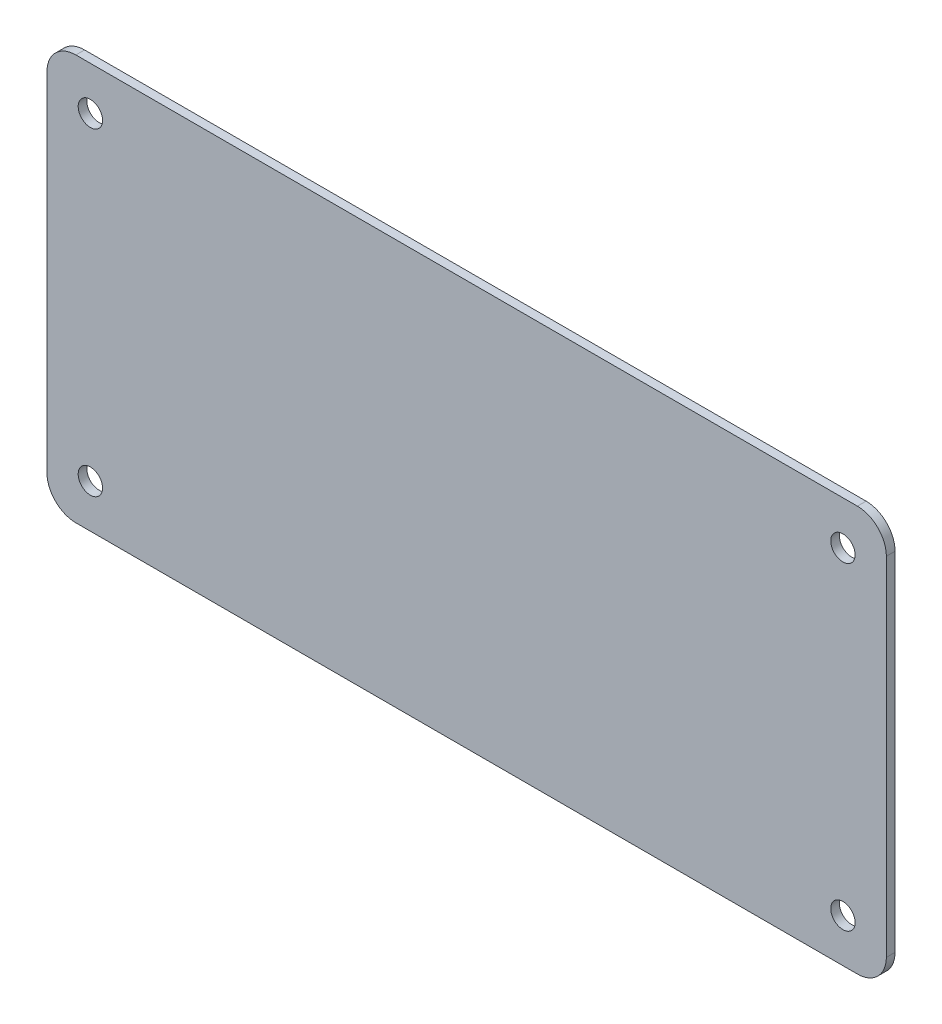
ISO-10303-21;
HEADER;
FILE_DESCRIPTION(('STEP AP214'),'2;1');
FILE_NAME('part.step','',(''),(''),'','','');
FILE_SCHEMA(('AUTOMOTIVE_DESIGN { 1 0 10303 214 1 1 1 1 }'));
ENDSEC;
DATA;
#1=APPLICATION_CONTEXT('core data for automotive mechanical design processes');
#2=APPLICATION_PROTOCOL_DEFINITION('international standard','automotive_design',2000,#1);
#3=PRODUCT_CONTEXT('',#1,'mechanical');
#4=PRODUCT('Part','Part','',(#3));
#5=PRODUCT_RELATED_PRODUCT_CATEGORY('part','',(#4));
#6=PRODUCT_DEFINITION_FORMATION('','',#4);
#7=PRODUCT_DEFINITION_CONTEXT('part definition',#1,'design');
#8=PRODUCT_DEFINITION('design','',#6,#7);
#9=PRODUCT_DEFINITION_SHAPE('','',#8);
#10=(LENGTH_UNIT() NAMED_UNIT(*) SI_UNIT(.MILLI.,.METRE.));
#11=(NAMED_UNIT(*) PLANE_ANGLE_UNIT() SI_UNIT($,.RADIAN.));
#12=(NAMED_UNIT(*) SI_UNIT($,.STERADIAN.) SOLID_ANGLE_UNIT());
#13=UNCERTAINTY_MEASURE_WITH_UNIT(LENGTH_MEASURE(1.E-05),#10,'distance_accuracy_value','');
#14=(GEOMETRIC_REPRESENTATION_CONTEXT(3) GLOBAL_UNCERTAINTY_ASSIGNED_CONTEXT((#13)) GLOBAL_UNIT_ASSIGNED_CONTEXT((#10,
#11,#12)) REPRESENTATION_CONTEXT('',''));
#15=CARTESIAN_POINT('',(0.,0.,0.));
#16=DIRECTION('',(0.,0.,1.));
#17=DIRECTION('',(1.,0.,0.));
#18=AXIS2_PLACEMENT_3D('',#15,#16,#17);
#19=CARTESIAN_POINT('',(145.,70.,3.));
#20=DIRECTION('',(-1.,0.,0.));
#21=DIRECTION('',(0.,-1.,0.));
#22=AXIS2_PLACEMENT_3D('',#19,#20,#21);
#23=PLANE('',#22);
#24=DIRECTION('',(0.,1.,0.));
#25=VECTOR('',#24,1.);
#26=CARTESIAN_POINT('',(145.,70.,3.));
#27=LINE('',#26,#25);
#28=CARTESIAN_POINT('',(145.,-60.,3.));
#29=VERTEX_POINT('',#28);
#30=CARTESIAN_POINT('',(145.,60.,3.));
#31=VERTEX_POINT('',#30);
#32=EDGE_CURVE('E129',#29,#31,#27,.T.);
#33=ORIENTED_EDGE('',*,*,#32,.F.);
#34=DIRECTION('',(0.,0.,-1.));
#35=VECTOR('',#34,1.);
#36=CARTESIAN_POINT('',(145.,-60.,3.));
#37=LINE('',#36,#35);
#38=CARTESIAN_POINT('',(145.,-60.,0.));
#39=VERTEX_POINT('',#38);
#40=EDGE_CURVE('E11',#29,#39,#37,.T.);
#41=ORIENTED_EDGE('',*,*,#40,.T.);
#42=DIRECTION('',(0.,1.,0.));
#43=VECTOR('',#42,1.);
#44=CARTESIAN_POINT('',(145.,70.,0.));
#45=LINE('',#44,#43);
#46=CARTESIAN_POINT('',(145.,60.,0.));
#47=VERTEX_POINT('',#46);
#48=EDGE_CURVE('E131',#39,#47,#45,.T.);
#49=ORIENTED_EDGE('',*,*,#48,.T.);
#50=DIRECTION('',(0.,0.,-1.));
#51=VECTOR('',#50,1.);
#52=CARTESIAN_POINT('',(145.,60.,3.));
#53=LINE('',#52,#51);
#54=EDGE_CURVE('E42',#47,#31,#53,.F.);
#55=ORIENTED_EDGE('',*,*,#54,.T.);
#56=EDGE_LOOP('',(#33,#41,#49,#55));
#57=FACE_BOUND('',#56,.T.);
#58=ADVANCED_FACE('F34',(#57),#23,.F.);
#59=CARTESIAN_POINT('',(-145.,70.,3.));
#60=DIRECTION('',(0.,-1.,0.));
#61=DIRECTION('',(0.,0.,-1.));
#62=AXIS2_PLACEMENT_3D('',#59,#60,#61);
#63=PLANE('',#62);
#64=DIRECTION('',(-1.,0.,0.));
#65=VECTOR('',#64,1.);
#66=CARTESIAN_POINT('',(-145.,70.,0.));
#67=LINE('',#66,#65);
#68=CARTESIAN_POINT('',(135.,70.,0.));
#69=VERTEX_POINT('',#68);
#70=CARTESIAN_POINT('',(-135.,70.,0.));
#71=VERTEX_POINT('',#70);
#72=EDGE_CURVE('E127',#69,#71,#67,.T.);
#73=ORIENTED_EDGE('',*,*,#72,.T.);
#74=DIRECTION('',(0.,0.,-1.));
#75=VECTOR('',#74,1.);
#76=CARTESIAN_POINT('',(-135.,70.,3.));
#77=LINE('',#76,#75);
#78=CARTESIAN_POINT('',(-135.,70.,3.));
#79=VERTEX_POINT('',#78);
#80=EDGE_CURVE('E106',#71,#79,#77,.F.);
#81=ORIENTED_EDGE('',*,*,#80,.T.);
#82=DIRECTION('',(-1.,0.,0.));
#83=VECTOR('',#82,1.);
#84=CARTESIAN_POINT('',(-145.,70.,3.));
#85=LINE('',#84,#83);
#86=CARTESIAN_POINT('',(135.,70.,3.));
#87=VERTEX_POINT('',#86);
#88=EDGE_CURVE('E167',#87,#79,#85,.T.);
#89=ORIENTED_EDGE('',*,*,#88,.F.);
#90=DIRECTION('',(0.,0.,-1.));
#91=VECTOR('',#90,1.);
#92=CARTESIAN_POINT('',(135.,70.,3.));
#93=LINE('',#92,#91);
#94=EDGE_CURVE('E111',#87,#69,#93,.T.);
#95=ORIENTED_EDGE('',*,*,#94,.T.);
#96=EDGE_LOOP('',(#73,#81,#89,#95));
#97=FACE_BOUND('',#96,.T.);
#98=ADVANCED_FACE('F171',(#97),#63,.F.);
#99=CARTESIAN_POINT('',(-145.,70.,3.));
#100=DIRECTION('',(1.,0.,0.));
#101=DIRECTION('',(0.,1.,0.));
#102=AXIS2_PLACEMENT_3D('',#99,#100,#101);
#103=PLANE('',#102);
#104=DIRECTION('',(0.,-1.,0.));
#105=VECTOR('',#104,1.);
#106=CARTESIAN_POINT('',(-145.,70.,3.));
#107=LINE('',#106,#105);
#108=CARTESIAN_POINT('',(-145.,60.,3.));
#109=VERTEX_POINT('',#108);
#110=CARTESIAN_POINT('',(-145.,-60.,3.));
#111=VERTEX_POINT('',#110);
#112=EDGE_CURVE('E120',#109,#111,#107,.T.);
#113=ORIENTED_EDGE('',*,*,#112,.F.);
#114=DIRECTION('',(0.,0.,-1.));
#115=VECTOR('',#114,1.);
#116=CARTESIAN_POINT('',(-145.,60.,3.));
#117=LINE('',#116,#115);
#118=CARTESIAN_POINT('',(-145.,60.,0.));
#119=VERTEX_POINT('',#118);
#120=EDGE_CURVE('E105',#109,#119,#117,.T.);
#121=ORIENTED_EDGE('',*,*,#120,.T.);
#122=DIRECTION('',(0.,-1.,0.));
#123=VECTOR('',#122,1.);
#124=CARTESIAN_POINT('',(-145.,70.,0.));
#125=LINE('',#124,#123);
#126=CARTESIAN_POINT('',(-145.,-60.,0.));
#127=VERTEX_POINT('',#126);
#128=EDGE_CURVE('E118',#119,#127,#125,.T.);
#129=ORIENTED_EDGE('',*,*,#128,.T.);
#130=DIRECTION('',(0.,0.,-1.));
#131=VECTOR('',#130,1.);
#132=CARTESIAN_POINT('',(-145.,-60.,3.));
#133=LINE('',#132,#131);
#134=EDGE_CURVE('E122',#127,#111,#133,.F.);
#135=ORIENTED_EDGE('',*,*,#134,.T.);
#136=EDGE_LOOP('',(#113,#121,#129,#135));
#137=FACE_BOUND('',#136,.T.);
#138=ADVANCED_FACE('F117',(#137),#103,.F.);
#139=CARTESIAN_POINT('',(-145.,-70.,3.));
#140=DIRECTION('',(0.,1.,0.));
#141=DIRECTION('',(0.,0.,1.));
#142=AXIS2_PLACEMENT_3D('',#139,#140,#141);
#143=PLANE('',#142);
#144=DIRECTION('',(1.,0.,0.));
#145=VECTOR('',#144,1.);
#146=CARTESIAN_POINT('',(-145.,-70.,3.));
#147=LINE('',#146,#145);
#148=CARTESIAN_POINT('',(-135.,-70.,3.));
#149=VERTEX_POINT('',#148);
#150=CARTESIAN_POINT('',(135.,-70.,3.));
#151=VERTEX_POINT('',#150);
#152=EDGE_CURVE('E135',#149,#151,#147,.T.);
#153=ORIENTED_EDGE('',*,*,#152,.F.);
#154=DIRECTION('',(0.,0.,-1.));
#155=VECTOR('',#154,1.);
#156=CARTESIAN_POINT('',(-135.,-70.,3.));
#157=LINE('',#156,#155);
#158=CARTESIAN_POINT('',(-135.,-70.,0.));
#159=VERTEX_POINT('',#158);
#160=EDGE_CURVE('E152',#149,#159,#157,.T.);
#161=ORIENTED_EDGE('',*,*,#160,.T.);
#162=DIRECTION('',(1.,0.,0.));
#163=VECTOR('',#162,1.);
#164=CARTESIAN_POINT('',(-145.,-70.,0.));
#165=LINE('',#164,#163);
#166=CARTESIAN_POINT('',(135.,-70.,0.));
#167=VERTEX_POINT('',#166);
#168=EDGE_CURVE('E126',#159,#167,#165,.T.);
#169=ORIENTED_EDGE('',*,*,#168,.T.);
#170=DIRECTION('',(0.,0.,-1.));
#171=VECTOR('',#170,1.);
#172=CARTESIAN_POINT('',(135.,-70.,3.));
#173=LINE('',#172,#171);
#174=EDGE_CURVE('E49',#167,#151,#173,.F.);
#175=ORIENTED_EDGE('',*,*,#174,.T.);
#176=EDGE_LOOP('',(#153,#161,#169,#175));
#177=FACE_BOUND('',#176,.T.);
#178=ADVANCED_FACE('F212',(#177),#143,.F.);
#179=CARTESIAN_POINT('',(145.,-70.,3.));
#180=DIRECTION('',(0.,0.,1.));
#181=DIRECTION('',(1.,0.,0.));
#182=AXIS2_PLACEMENT_3D('',#179,#180,#181);
#183=PLANE('',#182);
#184=CARTESIAN_POINT('',(130.,-55.,3.));
#185=DIRECTION('',(0.,0.,1.));
#186=DIRECTION('',(1.,0.,0.));
#187=AXIS2_PLACEMENT_3D('',#184,#185,#186);
#188=CIRCLE('',#187,4.21364201462621);
#189=CARTESIAN_POINT('',(134.213642014626,-55.,3.));
#190=VERTEX_POINT('',#189);
#191=EDGE_CURVE('E195',#190,#190,#188,.T.);
#192=ORIENTED_EDGE('',*,*,#191,.F.);
#193=EDGE_LOOP('',(#192));
#194=FACE_BOUND('',#193,.T.);
#195=CARTESIAN_POINT('',(130.,55.,3.));
#196=DIRECTION('',(0.,0.,1.));
#197=DIRECTION('',(1.,0.,0.));
#198=AXIS2_PLACEMENT_3D('',#195,#196,#197);
#199=CIRCLE('',#198,4.21364201462624);
#200=CARTESIAN_POINT('',(134.213642014626,55.,3.));
#201=VERTEX_POINT('',#200);
#202=EDGE_CURVE('E189',#201,#201,#199,.T.);
#203=ORIENTED_EDGE('',*,*,#202,.F.);
#204=EDGE_LOOP('',(#203));
#205=FACE_BOUND('',#204,.T.);
#206=CARTESIAN_POINT('',(-130.,-55.,3.));
#207=DIRECTION('',(0.,0.,1.));
#208=DIRECTION('',(1.,0.,0.));
#209=AXIS2_PLACEMENT_3D('',#206,#207,#208);
#210=CIRCLE('',#209,4.21364201462621);
#211=CARTESIAN_POINT('',(-125.786357985374,-55.,3.));
#212=VERTEX_POINT('',#211);
#213=EDGE_CURVE('E183',#212,#212,#210,.T.);
#214=ORIENTED_EDGE('',*,*,#213,.F.);
#215=EDGE_LOOP('',(#214));
#216=FACE_BOUND('',#215,.T.);
#217=CARTESIAN_POINT('',(-130.,55.,3.));
#218=DIRECTION('',(0.,0.,1.));
#219=DIRECTION('',(1.,0.,0.));
#220=AXIS2_PLACEMENT_3D('',#217,#218,#219);
#221=CIRCLE('',#220,4.21364201462621);
#222=CARTESIAN_POINT('',(-125.786357985374,55.,3.));
#223=VERTEX_POINT('',#222);
#224=EDGE_CURVE('E174',#223,#223,#221,.T.);
#225=ORIENTED_EDGE('',*,*,#224,.F.);
#226=EDGE_LOOP('',(#225));
#227=FACE_BOUND('',#226,.T.);
#228=ORIENTED_EDGE('',*,*,#88,.T.);
#229=CARTESIAN_POINT('',(-135.,60.,3.));
#230=DIRECTION('',(0.,0.,1.));
#231=DIRECTION('',(1.,0.,0.));
#232=AXIS2_PLACEMENT_3D('',#229,#230,#231);
#233=CIRCLE('',#232,10.);
#234=EDGE_CURVE('E149',#79,#109,#233,.T.);
#235=ORIENTED_EDGE('',*,*,#234,.T.);
#236=ORIENTED_EDGE('',*,*,#112,.T.);
#237=CARTESIAN_POINT('',(-135.,-60.,3.));
#238=DIRECTION('',(0.,0.,1.));
#239=DIRECTION('',(1.,0.,0.));
#240=AXIS2_PLACEMENT_3D('',#237,#238,#239);
#241=CIRCLE('',#240,10.);
#242=EDGE_CURVE('E56',#111,#149,#241,.T.);
#243=ORIENTED_EDGE('',*,*,#242,.T.);
#244=ORIENTED_EDGE('',*,*,#152,.T.);
#245=CARTESIAN_POINT('',(135.,-60.,3.));
#246=DIRECTION('',(0.,0.,1.));
#247=DIRECTION('',(1.,0.,0.));
#248=AXIS2_PLACEMENT_3D('',#245,#246,#247);
#249=CIRCLE('',#248,10.);
#250=EDGE_CURVE('E146',#151,#29,#249,.T.);
#251=ORIENTED_EDGE('',*,*,#250,.T.);
#252=ORIENTED_EDGE('',*,*,#32,.T.);
#253=CARTESIAN_POINT('',(135.,60.,3.));
#254=DIRECTION('',(0.,0.,1.));
#255=DIRECTION('',(1.,0.,0.));
#256=AXIS2_PLACEMENT_3D('',#253,#254,#255);
#257=CIRCLE('',#256,10.);
#258=EDGE_CURVE('E144',#31,#87,#257,.T.);
#259=ORIENTED_EDGE('',*,*,#258,.T.);
#260=EDGE_LOOP('',(#228,#235,#236,#243,#244,#251,#252,#259));
#261=FACE_BOUND('',#260,.T.);
#262=ADVANCED_FACE('F164',(#194,#205,#216,#227,#261),#183,.T.);
#263=CARTESIAN_POINT('',(145.,-70.,0.));
#264=DIRECTION('',(0.,0.,1.));
#265=DIRECTION('',(1.,0.,0.));
#266=AXIS2_PLACEMENT_3D('',#263,#264,#265);
#267=PLANE('',#266);
#268=CARTESIAN_POINT('',(130.,-55.,0.));
#269=DIRECTION('',(0.,0.,1.));
#270=DIRECTION('',(1.,0.,0.));
#271=AXIS2_PLACEMENT_3D('',#268,#269,#270);
#272=CIRCLE('',#271,4.21364201462621);
#273=CARTESIAN_POINT('',(134.213642014626,-55.,0.));
#274=VERTEX_POINT('',#273);
#275=EDGE_CURVE('E192',#274,#274,#272,.T.);
#276=ORIENTED_EDGE('',*,*,#275,.T.);
#277=EDGE_LOOP('',(#276));
#278=FACE_BOUND('',#277,.T.);
#279=CARTESIAN_POINT('',(130.,55.,0.));
#280=DIRECTION('',(0.,0.,1.));
#281=DIRECTION('',(1.,0.,0.));
#282=AXIS2_PLACEMENT_3D('',#279,#280,#281);
#283=CIRCLE('',#282,4.21364201462624);
#284=CARTESIAN_POINT('',(134.213642014626,55.,0.));
#285=VERTEX_POINT('',#284);
#286=EDGE_CURVE('E186',#285,#285,#283,.T.);
#287=ORIENTED_EDGE('',*,*,#286,.T.);
#288=EDGE_LOOP('',(#287));
#289=FACE_BOUND('',#288,.T.);
#290=CARTESIAN_POINT('',(-130.,-55.,0.));
#291=DIRECTION('',(0.,0.,1.));
#292=DIRECTION('',(1.,0.,0.));
#293=AXIS2_PLACEMENT_3D('',#290,#291,#292);
#294=CIRCLE('',#293,4.21364201462621);
#295=CARTESIAN_POINT('',(-125.786357985374,-55.,0.));
#296=VERTEX_POINT('',#295);
#297=EDGE_CURVE('E181',#296,#296,#294,.T.);
#298=ORIENTED_EDGE('',*,*,#297,.T.);
#299=EDGE_LOOP('',(#298));
#300=FACE_BOUND('',#299,.T.);
#301=CARTESIAN_POINT('',(-130.,55.,0.));
#302=DIRECTION('',(0.,0.,1.));
#303=DIRECTION('',(1.,0.,0.));
#304=AXIS2_PLACEMENT_3D('',#301,#302,#303);
#305=CIRCLE('',#304,4.21364201462621);
#306=CARTESIAN_POINT('',(-125.786357985374,55.,0.));
#307=VERTEX_POINT('',#306);
#308=EDGE_CURVE('E172',#307,#307,#305,.T.);
#309=ORIENTED_EDGE('',*,*,#308,.T.);
#310=EDGE_LOOP('',(#309));
#311=FACE_BOUND('',#310,.T.);
#312=ORIENTED_EDGE('',*,*,#128,.F.);
#313=CARTESIAN_POINT('',(-135.,60.,0.));
#314=DIRECTION('',(0.,0.,1.));
#315=DIRECTION('',(1.,0.,0.));
#316=AXIS2_PLACEMENT_3D('',#313,#314,#315);
#317=CIRCLE('',#316,10.);
#318=EDGE_CURVE('E101',#119,#71,#317,.F.);
#319=ORIENTED_EDGE('',*,*,#318,.T.);
#320=ORIENTED_EDGE('',*,*,#72,.F.);
#321=CARTESIAN_POINT('',(135.,60.,0.));
#322=DIRECTION('',(0.,0.,1.));
#323=DIRECTION('',(1.,0.,0.));
#324=AXIS2_PLACEMENT_3D('',#321,#322,#323);
#325=CIRCLE('',#324,10.);
#326=EDGE_CURVE('E121',#69,#47,#325,.F.);
#327=ORIENTED_EDGE('',*,*,#326,.T.);
#328=ORIENTED_EDGE('',*,*,#48,.F.);
#329=CARTESIAN_POINT('',(135.,-60.,0.));
#330=DIRECTION('',(0.,0.,1.));
#331=DIRECTION('',(1.,0.,0.));
#332=AXIS2_PLACEMENT_3D('',#329,#330,#331);
#333=CIRCLE('',#332,10.);
#334=EDGE_CURVE('E138',#39,#167,#333,.F.);
#335=ORIENTED_EDGE('',*,*,#334,.T.);
#336=ORIENTED_EDGE('',*,*,#168,.F.);
#337=CARTESIAN_POINT('',(-135.,-60.,0.));
#338=DIRECTION('',(0.,0.,1.));
#339=DIRECTION('',(1.,0.,0.));
#340=AXIS2_PLACEMENT_3D('',#337,#338,#339);
#341=CIRCLE('',#340,10.);
#342=EDGE_CURVE('E112',#159,#127,#341,.F.);
#343=ORIENTED_EDGE('',*,*,#342,.T.);
#344=EDGE_LOOP('',(#312,#319,#320,#327,#328,#335,#336,#343));
#345=FACE_BOUND('',#344,.T.);
#346=ADVANCED_FACE('F124',(#278,#289,#300,#311,#345),#267,.F.);
#347=CARTESIAN_POINT('',(-135.,60.,3.));
#348=DIRECTION('',(0.,0.,-1.));
#349=DIRECTION('',(-1.,0.,0.));
#350=AXIS2_PLACEMENT_3D('',#347,#348,#349);
#351=CYLINDRICAL_SURFACE('',#350,10.);
#352=ORIENTED_EDGE('',*,*,#234,.F.);
#353=ORIENTED_EDGE('',*,*,#80,.F.);
#354=ORIENTED_EDGE('',*,*,#318,.F.);
#355=ORIENTED_EDGE('',*,*,#120,.F.);
#356=EDGE_LOOP('',(#352,#353,#354,#355));
#357=FACE_BOUND('',#356,.T.);
#358=ADVANCED_FACE('F104',(#357),#351,.T.);
#359=CARTESIAN_POINT('',(-135.,-60.,3.));
#360=DIRECTION('',(0.,0.,-1.));
#361=DIRECTION('',(-1.,0.,0.));
#362=AXIS2_PLACEMENT_3D('',#359,#360,#361);
#363=CYLINDRICAL_SURFACE('',#362,10.);
#364=ORIENTED_EDGE('',*,*,#242,.F.);
#365=ORIENTED_EDGE('',*,*,#134,.F.);
#366=ORIENTED_EDGE('',*,*,#342,.F.);
#367=ORIENTED_EDGE('',*,*,#160,.F.);
#368=EDGE_LOOP('',(#364,#365,#366,#367));
#369=FACE_BOUND('',#368,.T.);
#370=ADVANCED_FACE('F243',(#369),#363,.T.);
#371=CARTESIAN_POINT('',(135.,-60.,3.));
#372=DIRECTION('',(0.,0.,-1.));
#373=DIRECTION('',(-1.,0.,0.));
#374=AXIS2_PLACEMENT_3D('',#371,#372,#373);
#375=CYLINDRICAL_SURFACE('',#374,10.);
#376=ORIENTED_EDGE('',*,*,#250,.F.);
#377=ORIENTED_EDGE('',*,*,#174,.F.);
#378=ORIENTED_EDGE('',*,*,#334,.F.);
#379=ORIENTED_EDGE('',*,*,#40,.F.);
#380=EDGE_LOOP('',(#376,#377,#378,#379));
#381=FACE_BOUND('',#380,.T.);
#382=ADVANCED_FACE('F231',(#381),#375,.T.);
#383=CARTESIAN_POINT('',(135.,60.,3.));
#384=DIRECTION('',(0.,0.,-1.));
#385=DIRECTION('',(-1.,0.,0.));
#386=AXIS2_PLACEMENT_3D('',#383,#384,#385);
#387=CYLINDRICAL_SURFACE('',#386,10.);
#388=ORIENTED_EDGE('',*,*,#258,.F.);
#389=ORIENTED_EDGE('',*,*,#54,.F.);
#390=ORIENTED_EDGE('',*,*,#326,.F.);
#391=ORIENTED_EDGE('',*,*,#94,.F.);
#392=EDGE_LOOP('',(#388,#389,#390,#391));
#393=FACE_BOUND('',#392,.T.);
#394=ADVANCED_FACE('F36',(#393),#387,.T.);
#395=CARTESIAN_POINT('',(-130.,55.,0.));
#396=DIRECTION('',(0.,0.,1.));
#397=DIRECTION('',(1.,0.,0.));
#398=AXIS2_PLACEMENT_3D('',#395,#396,#397);
#399=CYLINDRICAL_SURFACE('',#398,4.21364201462621);
#400=ORIENTED_EDGE('',*,*,#308,.F.);
#401=EDGE_LOOP('',(#400));
#402=FACE_BOUND('',#401,.T.);
#403=ORIENTED_EDGE('',*,*,#224,.T.);
#404=EDGE_LOOP('',(#403));
#405=FACE_BOUND('',#404,.T.);
#406=ADVANCED_FACE('F220',(#402,#405),#399,.F.);
#407=CARTESIAN_POINT('',(-130.,-55.,0.));
#408=DIRECTION('',(0.,0.,1.));
#409=DIRECTION('',(1.,0.,0.));
#410=AXIS2_PLACEMENT_3D('',#407,#408,#409);
#411=CYLINDRICAL_SURFACE('',#410,4.21364201462621);
#412=ORIENTED_EDGE('',*,*,#297,.F.);
#413=EDGE_LOOP('',(#412));
#414=FACE_BOUND('',#413,.T.);
#415=ORIENTED_EDGE('',*,*,#213,.T.);
#416=EDGE_LOOP('',(#415));
#417=FACE_BOUND('',#416,.T.);
#418=ADVANCED_FACE('F222',(#414,#417),#411,.F.);
#419=CARTESIAN_POINT('',(130.,55.,0.));
#420=DIRECTION('',(0.,0.,1.));
#421=DIRECTION('',(1.,0.,0.));
#422=AXIS2_PLACEMENT_3D('',#419,#420,#421);
#423=CYLINDRICAL_SURFACE('',#422,4.21364201462624);
#424=ORIENTED_EDGE('',*,*,#286,.F.);
#425=EDGE_LOOP('',(#424));
#426=FACE_BOUND('',#425,.T.);
#427=ORIENTED_EDGE('',*,*,#202,.T.);
#428=EDGE_LOOP('',(#427));
#429=FACE_BOUND('',#428,.T.);
#430=ADVANCED_FACE('F206',(#426,#429),#423,.F.);
#431=CARTESIAN_POINT('',(130.,-55.,0.));
#432=DIRECTION('',(0.,0.,1.));
#433=DIRECTION('',(1.,0.,0.));
#434=AXIS2_PLACEMENT_3D('',#431,#432,#433);
#435=CYLINDRICAL_SURFACE('',#434,4.21364201462621);
#436=ORIENTED_EDGE('',*,*,#275,.F.);
#437=EDGE_LOOP('',(#436));
#438=FACE_BOUND('',#437,.T.);
#439=ORIENTED_EDGE('',*,*,#191,.T.);
#440=EDGE_LOOP('',(#439));
#441=FACE_BOUND('',#440,.T.);
#442=ADVANCED_FACE('F203',(#438,#441),#435,.F.);
#443=CLOSED_SHELL('',(#58,#98,#138,#178,#262,#346,#358,#370,#382,#394,#406,#418,#430,#442));
#444=MANIFOLD_SOLID_BREP('B2',#443);
#445=ADVANCED_BREP_SHAPE_REPRESENTATION('',(#18,#444),#14);
#446=SHAPE_DEFINITION_REPRESENTATION(#9,#445);
ENDSEC;
END-ISO-10303-21;
